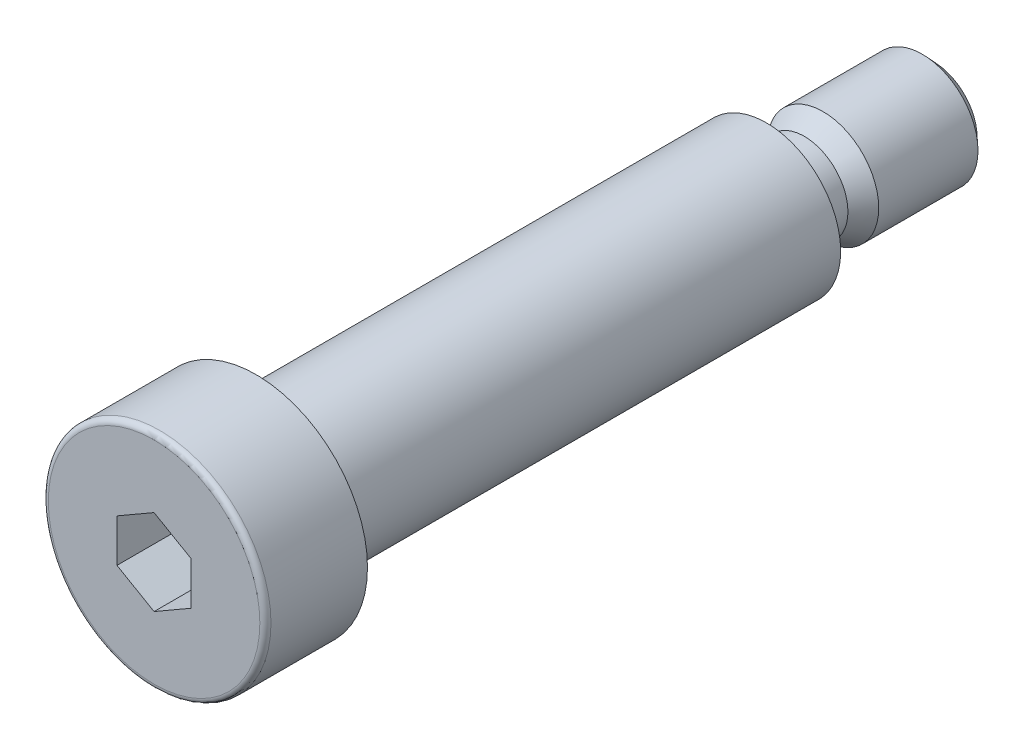
ISO-10303-21;
HEADER;
FILE_DESCRIPTION(('STEP AP214'),'2;1');
FILE_NAME('part.step','',(''),(''),'','','');
FILE_SCHEMA(('AUTOMOTIVE_DESIGN { 1 0 10303 214 1 1 1 1 }'));
ENDSEC;
DATA;
#1=APPLICATION_CONTEXT('core data for automotive mechanical design processes');
#2=APPLICATION_PROTOCOL_DEFINITION('international standard','automotive_design',2000,#1);
#3=PRODUCT_CONTEXT('',#1,'mechanical');
#4=PRODUCT('Part','Part','',(#3));
#5=PRODUCT_RELATED_PRODUCT_CATEGORY('part','',(#4));
#6=PRODUCT_DEFINITION_FORMATION('','',#4);
#7=PRODUCT_DEFINITION_CONTEXT('part definition',#1,'design');
#8=PRODUCT_DEFINITION('design','',#6,#7);
#9=PRODUCT_DEFINITION_SHAPE('','',#8);
#10=(LENGTH_UNIT() NAMED_UNIT(*) SI_UNIT(.MILLI.,.METRE.));
#11=(NAMED_UNIT(*) PLANE_ANGLE_UNIT() SI_UNIT($,.RADIAN.));
#12=(NAMED_UNIT(*) SI_UNIT($,.STERADIAN.) SOLID_ANGLE_UNIT());
#13=UNCERTAINTY_MEASURE_WITH_UNIT(LENGTH_MEASURE(1.E-05),#10,'distance_accuracy_value','');
#14=(GEOMETRIC_REPRESENTATION_CONTEXT(3) GLOBAL_UNCERTAINTY_ASSIGNED_CONTEXT((#13)) GLOBAL_UNIT_ASSIGNED_CONTEXT((#10,
#11,#12)) REPRESENTATION_CONTEXT('',''));
#15=CARTESIAN_POINT('',(0.,0.,0.));
#16=DIRECTION('',(0.,0.,1.));
#17=DIRECTION('',(1.,0.,0.));
#18=AXIS2_PLACEMENT_3D('',#15,#16,#17);
#19=CARTESIAN_POINT('',(0.,0.,38.5));
#20=DIRECTION('',(0.,0.,1.));
#21=DIRECTION('',(1.,0.,0.));
#22=AXIS2_PLACEMENT_3D('',#19,#20,#21);
#23=PLANE('',#22);
#24=CARTESIAN_POINT('',(0.,0.,38.5));
#25=DIRECTION('',(0.,0.,1.));
#26=DIRECTION('',(1.,0.,0.));
#27=AXIS2_PLACEMENT_3D('',#24,#25,#26);
#28=CIRCLE('',#27,11.4);
#29=CARTESIAN_POINT('',(11.4,0.,38.5));
#30=VERTEX_POINT('',#29);
#31=EDGE_CURVE('E42',#30,#30,#28,.T.);
#32=ORIENTED_EDGE('',*,*,#31,.T.);
#33=EDGE_LOOP('',(#32));
#34=FACE_BOUND('',#33,.T.);
#35=DIRECTION('',(0.,1.,0.));
#36=VECTOR('',#35,1.);
#37=CARTESIAN_POINT('',(4.,-2.30940107675851,38.5));
#38=LINE('',#37,#36);
#39=CARTESIAN_POINT('',(4.,-2.30940107675851,38.5));
#40=VERTEX_POINT('',#39);
#41=CARTESIAN_POINT('',(4.,2.3094010767585,38.5));
#42=VERTEX_POINT('',#41);
#43=EDGE_CURVE('E49',#40,#42,#38,.T.);
#44=ORIENTED_EDGE('',*,*,#43,.F.);
#45=DIRECTION('',(0.866025403784439,0.5,0.));
#46=VECTOR('',#45,1.);
#47=CARTESIAN_POINT('',(0.,-4.61880215351701,38.5));
#48=LINE('',#47,#46);
#49=CARTESIAN_POINT('',(0.,-4.61880215351701,38.5));
#50=VERTEX_POINT('',#49);
#51=EDGE_CURVE('E132',#50,#40,#48,.T.);
#52=ORIENTED_EDGE('',*,*,#51,.F.);
#53=DIRECTION('',(0.866025403784439,-0.5,0.));
#54=VECTOR('',#53,1.);
#55=CARTESIAN_POINT('',(-4.,-2.3094010767585,38.5));
#56=LINE('',#55,#54);
#57=CARTESIAN_POINT('',(-4.,-2.3094010767585,38.5));
#58=VERTEX_POINT('',#57);
#59=EDGE_CURVE('E130',#58,#50,#56,.T.);
#60=ORIENTED_EDGE('',*,*,#59,.F.);
#61=DIRECTION('',(0.,-1.,0.));
#62=VECTOR('',#61,1.);
#63=CARTESIAN_POINT('',(-4.,2.30940107675851,38.5));
#64=LINE('',#63,#62);
#65=CARTESIAN_POINT('',(-4.,2.30940107675851,38.5));
#66=VERTEX_POINT('',#65);
#67=EDGE_CURVE('E97',#66,#58,#64,.T.);
#68=ORIENTED_EDGE('',*,*,#67,.F.);
#69=DIRECTION('',(-0.866025403784439,-0.5,0.));
#70=VECTOR('',#69,1.);
#71=CARTESIAN_POINT('',(0.,4.61880215351701,38.5));
#72=LINE('',#71,#70);
#73=CARTESIAN_POINT('',(0.,4.61880215351701,38.5));
#74=VERTEX_POINT('',#73);
#75=EDGE_CURVE('E126',#74,#66,#72,.T.);
#76=ORIENTED_EDGE('',*,*,#75,.F.);
#77=DIRECTION('',(-0.866025403784439,0.5,0.));
#78=VECTOR('',#77,1.);
#79=CARTESIAN_POINT('',(4.,2.3094010767585,38.5));
#80=LINE('',#79,#78);
#81=EDGE_CURVE('E123',#42,#74,#80,.T.);
#82=ORIENTED_EDGE('',*,*,#81,.F.);
#83=EDGE_LOOP('',(#44,#52,#60,#68,#76,#82));
#84=FACE_BOUND('',#83,.T.);
#85=ADVANCED_FACE('F34',(#34,#84),#23,.T.);
#86=CARTESIAN_POINT('',(0.,0.,-45.5));
#87=DIRECTION('',(0.,0.,1.));
#88=DIRECTION('',(1.,0.,0.));
#89=AXIS2_PLACEMENT_3D('',#86,#87,#88);
#90=PLANE('',#89);
#91=CARTESIAN_POINT('',(0.,0.,-45.5));
#92=DIRECTION('',(0.,0.,1.));
#93=DIRECTION('',(1.,0.,0.));
#94=AXIS2_PLACEMENT_3D('',#91,#92,#93);
#95=CIRCLE('',#94,4.7);
#96=CARTESIAN_POINT('',(4.7,0.,-45.5));
#97=VERTEX_POINT('',#96);
#98=EDGE_CURVE('E162',#97,#97,#95,.T.);
#99=ORIENTED_EDGE('',*,*,#98,.F.);
#100=EDGE_LOOP('',(#99));
#101=FACE_BOUND('',#100,.T.);
#102=ADVANCED_FACE('F178',(#101),#90,.F.);
#103=CARTESIAN_POINT('',(0.,0.,-45.5));
#104=DIRECTION('',(0.,0.,1.));
#105=DIRECTION('',(1.,0.,0.));
#106=AXIS2_PLACEMENT_3D('',#103,#104,#105);
#107=CONICAL_SURFACE('',#106,4.7,0.825376850520742);
#108=CARTESIAN_POINT('',(0.,0.,-44.3));
#109=DIRECTION('',(0.,0.,1.));
#110=DIRECTION('',(1.,0.,0.));
#111=AXIS2_PLACEMENT_3D('',#108,#109,#110);
#112=CIRCLE('',#111,6.);
#113=CARTESIAN_POINT('',(6.,0.,-44.3));
#114=VERTEX_POINT('',#113);
#115=EDGE_CURVE('E159',#114,#114,#112,.T.);
#116=ORIENTED_EDGE('',*,*,#115,.F.);
#117=EDGE_LOOP('',(#116));
#118=FACE_BOUND('',#117,.T.);
#119=ORIENTED_EDGE('',*,*,#98,.T.);
#120=EDGE_LOOP('',(#119));
#121=FACE_BOUND('',#120,.T.);
#122=ADVANCED_FACE('F182',(#118,#121),#107,.T.);
#123=CARTESIAN_POINT('',(0.,0.,38.5));
#124=DIRECTION('',(0.,0.,1.));
#125=DIRECTION('',(1.,0.,0.));
#126=AXIS2_PLACEMENT_3D('',#123,#124,#125);
#127=CYLINDRICAL_SURFACE('',#126,6.);
#128=CARTESIAN_POINT('',(0.,0.,-33.6));
#129=DIRECTION('',(0.,0.,1.));
#130=DIRECTION('',(1.,0.,0.));
#131=AXIS2_PLACEMENT_3D('',#128,#129,#130);
#132=CIRCLE('',#131,6.);
#133=CARTESIAN_POINT('',(6.,0.,-33.6));
#134=VERTEX_POINT('',#133);
#135=EDGE_CURVE('E156',#134,#134,#132,.T.);
#136=ORIENTED_EDGE('',*,*,#135,.F.);
#137=EDGE_LOOP('',(#136));
#138=FACE_BOUND('',#137,.T.);
#139=ORIENTED_EDGE('',*,*,#115,.T.);
#140=EDGE_LOOP('',(#139));
#141=FACE_BOUND('',#140,.T.);
#142=ADVANCED_FACE('F188',(#138,#141),#127,.T.);
#143=CARTESIAN_POINT('',(0.,0.,-33.6));
#144=DIRECTION('',(0.,0.,-1.));
#145=DIRECTION('',(-1.,0.,0.));
#146=AXIS2_PLACEMENT_3D('',#143,#144,#145);
#147=CONICAL_SURFACE('',#146,6.,0.571837729916956);
#148=CARTESIAN_POINT('',(0.,0.,-31.58));
#149=DIRECTION('',(0.,0.,1.));
#150=DIRECTION('',(1.,0.,0.));
#151=AXIS2_PLACEMENT_3D('',#148,#149,#150);
#152=CIRCLE('',#151,4.70000000000001);
#153=CARTESIAN_POINT('',(4.70000000000001,0.,-31.58));
#154=VERTEX_POINT('',#153);
#155=EDGE_CURVE('E153',#154,#154,#152,.T.);
#156=ORIENTED_EDGE('',*,*,#155,.F.);
#157=EDGE_LOOP('',(#156));
#158=FACE_BOUND('',#157,.T.);
#159=ORIENTED_EDGE('',*,*,#135,.T.);
#160=EDGE_LOOP('',(#159));
#161=FACE_BOUND('',#160,.T.);
#162=ADVANCED_FACE('F192',(#158,#161),#147,.T.);
#163=CARTESIAN_POINT('',(0.,0.,38.5));
#164=DIRECTION('',(0.,0.,1.));
#165=DIRECTION('',(1.,0.,0.));
#166=AXIS2_PLACEMENT_3D('',#163,#164,#165);
#167=CYLINDRICAL_SURFACE('',#166,4.70000000000001);
#168=ORIENTED_EDGE('',*,*,#155,.T.);
#169=EDGE_LOOP('',(#168));
#170=FACE_BOUND('',#169,.T.);
#171=CARTESIAN_POINT('',(0.,0.,-27.5));
#172=DIRECTION('',(0.,0.,1.));
#173=DIRECTION('',(1.,0.,0.));
#174=AXIS2_PLACEMENT_3D('',#171,#172,#173);
#175=CIRCLE('',#174,4.70000000000001);
#176=CARTESIAN_POINT('',(4.70000000000001,0.,-27.5));
#177=VERTEX_POINT('',#176);
#178=EDGE_CURVE('E150',#177,#177,#175,.T.);
#179=ORIENTED_EDGE('',*,*,#178,.F.);
#180=EDGE_LOOP('',(#179));
#181=FACE_BOUND('',#180,.T.);
#182=ADVANCED_FACE('F196',(#170,#181),#167,.T.);
#183=CARTESIAN_POINT('',(0.,0.,-27.5));
#184=DIRECTION('',(0.,0.,1.));
#185=DIRECTION('',(1.,0.,0.));
#186=AXIS2_PLACEMENT_3D('',#183,#184,#185);
#187=PLANE('',#186);
#188=CARTESIAN_POINT('',(0.,0.,-27.5));
#189=DIRECTION('',(0.,0.,1.));
#190=DIRECTION('',(1.,0.,0.));
#191=AXIS2_PLACEMENT_3D('',#188,#189,#190);
#192=CIRCLE('',#191,7.99999999999999);
#193=CARTESIAN_POINT('',(7.99999999999999,0.,-27.5));
#194=VERTEX_POINT('',#193);
#195=EDGE_CURVE('E147',#194,#194,#192,.T.);
#196=ORIENTED_EDGE('',*,*,#195,.F.);
#197=EDGE_LOOP('',(#196));
#198=FACE_BOUND('',#197,.T.);
#199=ORIENTED_EDGE('',*,*,#178,.T.);
#200=EDGE_LOOP('',(#199));
#201=FACE_BOUND('',#200,.T.);
#202=ADVANCED_FACE('F200',(#198,#201),#187,.F.);
#203=CARTESIAN_POINT('',(0.,0.,38.5));
#204=DIRECTION('',(0.,0.,1.));
#205=DIRECTION('',(1.,0.,0.));
#206=AXIS2_PLACEMENT_3D('',#203,#204,#205);
#207=CYLINDRICAL_SURFACE('',#206,7.99999999999999);
#208=ORIENTED_EDGE('',*,*,#195,.T.);
#209=EDGE_LOOP('',(#208));
#210=FACE_BOUND('',#209,.T.);
#211=CARTESIAN_POINT('',(0.,0.,27.5));
#212=DIRECTION('',(0.,0.,1.));
#213=DIRECTION('',(1.,0.,0.));
#214=AXIS2_PLACEMENT_3D('',#211,#212,#213);
#215=CIRCLE('',#214,7.99999999999999);
#216=CARTESIAN_POINT('',(7.99999999999999,0.,27.5));
#217=VERTEX_POINT('',#216);
#218=EDGE_CURVE('E144',#217,#217,#215,.T.);
#219=ORIENTED_EDGE('',*,*,#218,.F.);
#220=EDGE_LOOP('',(#219));
#221=FACE_BOUND('',#220,.T.);
#222=ADVANCED_FACE('F204',(#210,#221),#207,.T.);
#223=CARTESIAN_POINT('',(0.,0.,27.5));
#224=DIRECTION('',(0.,0.,1.));
#225=DIRECTION('',(1.,0.,0.));
#226=AXIS2_PLACEMENT_3D('',#223,#224,#225);
#227=PLANE('',#226);
#228=CARTESIAN_POINT('',(0.,0.,27.5));
#229=DIRECTION('',(0.,0.,1.));
#230=DIRECTION('',(1.,0.,0.));
#231=AXIS2_PLACEMENT_3D('',#228,#229,#230);
#232=CIRCLE('',#231,12.);
#233=CARTESIAN_POINT('',(12.,0.,27.5));
#234=VERTEX_POINT('',#233);
#235=EDGE_CURVE('E136',#234,#234,#232,.T.);
#236=ORIENTED_EDGE('',*,*,#235,.F.);
#237=EDGE_LOOP('',(#236));
#238=FACE_BOUND('',#237,.T.);
#239=ORIENTED_EDGE('',*,*,#218,.T.);
#240=EDGE_LOOP('',(#239));
#241=FACE_BOUND('',#240,.T.);
#242=ADVANCED_FACE('F208',(#238,#241),#227,.F.);
#243=CARTESIAN_POINT('',(0.,0.,38.5));
#244=DIRECTION('',(0.,0.,1.));
#245=DIRECTION('',(1.,0.,0.));
#246=AXIS2_PLACEMENT_3D('',#243,#244,#245);
#247=CYLINDRICAL_SURFACE('',#246,12.);
#248=CARTESIAN_POINT('',(0.,0.,37.9));
#249=DIRECTION('',(0.,0.,1.));
#250=DIRECTION('',(1.,0.,0.));
#251=AXIS2_PLACEMENT_3D('',#248,#249,#250);
#252=CIRCLE('',#251,12.);
#253=CARTESIAN_POINT('',(12.,0.,37.9));
#254=VERTEX_POINT('',#253);
#255=EDGE_CURVE('E11',#254,#254,#252,.F.);
#256=ORIENTED_EDGE('',*,*,#255,.T.);
#257=EDGE_LOOP('',(#256));
#258=FACE_BOUND('',#257,.T.);
#259=ORIENTED_EDGE('',*,*,#235,.T.);
#260=EDGE_LOOP('',(#259));
#261=FACE_BOUND('',#260,.T.);
#262=ADVANCED_FACE('F212',(#258,#261),#247,.T.);
#263=CARTESIAN_POINT('',(4.,-2.30940107675851,31.9));
#264=DIRECTION('',(1.,0.,0.));
#265=DIRECTION('',(0.,0.,-1.));
#266=AXIS2_PLACEMENT_3D('',#263,#264,#265);
#267=PLANE('',#266);
#268=ORIENTED_EDGE('',*,*,#43,.T.);
#269=DIRECTION('',(0.,0.,1.));
#270=VECTOR('',#269,1.);
#271=CARTESIAN_POINT('',(4.,2.3094010767585,31.9));
#272=LINE('',#271,#270);
#273=CARTESIAN_POINT('',(4.,2.3094010767585,31.9));
#274=VERTEX_POINT('',#273);
#275=EDGE_CURVE('E79',#274,#42,#272,.T.);
#276=ORIENTED_EDGE('',*,*,#275,.F.);
#277=DIRECTION('',(0.,1.,0.));
#278=VECTOR('',#277,1.);
#279=CARTESIAN_POINT('',(4.,-2.30940107675851,31.9));
#280=LINE('',#279,#278);
#281=CARTESIAN_POINT('',(4.,-2.30940107675851,31.9));
#282=VERTEX_POINT('',#281);
#283=EDGE_CURVE('E134',#282,#274,#280,.T.);
#284=ORIENTED_EDGE('',*,*,#283,.F.);
#285=DIRECTION('',(0.,0.,1.));
#286=VECTOR('',#285,1.);
#287=CARTESIAN_POINT('',(4.,-2.30940107675851,31.9));
#288=LINE('',#287,#286);
#289=EDGE_CURVE('E57',#282,#40,#288,.T.);
#290=ORIENTED_EDGE('',*,*,#289,.T.);
#291=EDGE_LOOP('',(#268,#276,#284,#290));
#292=FACE_BOUND('',#291,.T.);
#293=ADVANCED_FACE('F216',(#292),#267,.F.);
#294=CARTESIAN_POINT('',(0.,-4.61880215351701,31.9));
#295=DIRECTION('',(0.5,-0.866025403784439,0.));
#296=DIRECTION('',(0.866025403784439,0.5,0.));
#297=AXIS2_PLACEMENT_3D('',#294,#295,#296);
#298=PLANE('',#297);
#299=ORIENTED_EDGE('',*,*,#51,.T.);
#300=ORIENTED_EDGE('',*,*,#289,.F.);
#301=DIRECTION('',(0.866025403784439,0.5,0.));
#302=VECTOR('',#301,1.);
#303=CARTESIAN_POINT('',(0.,-4.61880215351701,31.9));
#304=LINE('',#303,#302);
#305=CARTESIAN_POINT('',(0.,-4.61880215351701,31.9));
#306=VERTEX_POINT('',#305);
#307=EDGE_CURVE('E109',#306,#282,#304,.T.);
#308=ORIENTED_EDGE('',*,*,#307,.F.);
#309=DIRECTION('',(0.,0.,1.));
#310=VECTOR('',#309,1.);
#311=CARTESIAN_POINT('',(0.,-4.61880215351701,31.9));
#312=LINE('',#311,#310);
#313=EDGE_CURVE('E101',#306,#50,#312,.T.);
#314=ORIENTED_EDGE('',*,*,#313,.T.);
#315=EDGE_LOOP('',(#299,#300,#308,#314));
#316=FACE_BOUND('',#315,.T.);
#317=ADVANCED_FACE('F220',(#316),#298,.F.);
#318=CARTESIAN_POINT('',(-4.,-2.3094010767585,31.9));
#319=DIRECTION('',(-0.5,-0.866025403784439,0.));
#320=DIRECTION('',(0.866025403784439,-0.5,0.));
#321=AXIS2_PLACEMENT_3D('',#318,#319,#320);
#322=PLANE('',#321);
#323=ORIENTED_EDGE('',*,*,#59,.T.);
#324=ORIENTED_EDGE('',*,*,#313,.F.);
#325=DIRECTION('',(0.866025403784439,-0.5,0.));
#326=VECTOR('',#325,1.);
#327=CARTESIAN_POINT('',(-4.,-2.3094010767585,31.9));
#328=LINE('',#327,#326);
#329=CARTESIAN_POINT('',(-4.,-2.3094010767585,31.9));
#330=VERTEX_POINT('',#329);
#331=EDGE_CURVE('E105',#330,#306,#328,.T.);
#332=ORIENTED_EDGE('',*,*,#331,.F.);
#333=DIRECTION('',(0.,0.,1.));
#334=VECTOR('',#333,1.);
#335=CARTESIAN_POINT('',(-4.,-2.3094010767585,31.9));
#336=LINE('',#335,#334);
#337=EDGE_CURVE('E90',#330,#58,#336,.T.);
#338=ORIENTED_EDGE('',*,*,#337,.T.);
#339=EDGE_LOOP('',(#323,#324,#332,#338));
#340=FACE_BOUND('',#339,.T.);
#341=ADVANCED_FACE('F106',(#340),#322,.F.);
#342=CARTESIAN_POINT('',(-4.,2.30940107675851,31.9));
#343=DIRECTION('',(-1.,0.,0.));
#344=DIRECTION('',(0.,-1.,0.));
#345=AXIS2_PLACEMENT_3D('',#342,#343,#344);
#346=PLANE('',#345);
#347=ORIENTED_EDGE('',*,*,#67,.T.);
#348=ORIENTED_EDGE('',*,*,#337,.F.);
#349=DIRECTION('',(0.,-1.,0.));
#350=VECTOR('',#349,1.);
#351=CARTESIAN_POINT('',(-4.,2.30940107675851,31.9));
#352=LINE('',#351,#350);
#353=CARTESIAN_POINT('',(-4.,2.30940107675851,31.9));
#354=VERTEX_POINT('',#353);
#355=EDGE_CURVE('E94',#354,#330,#352,.T.);
#356=ORIENTED_EDGE('',*,*,#355,.F.);
#357=DIRECTION('',(0.,0.,1.));
#358=VECTOR('',#357,1.);
#359=CARTESIAN_POINT('',(-4.,2.30940107675851,31.9));
#360=LINE('',#359,#358);
#361=EDGE_CURVE('E102',#354,#66,#360,.T.);
#362=ORIENTED_EDGE('',*,*,#361,.T.);
#363=EDGE_LOOP('',(#347,#348,#356,#362));
#364=FACE_BOUND('',#363,.T.);
#365=ADVANCED_FACE('F92',(#364),#346,.F.);
#366=CARTESIAN_POINT('',(0.,4.61880215351701,31.9));
#367=DIRECTION('',(-0.5,0.866025403784439,0.));
#368=DIRECTION('',(-0.866025403784439,-0.5,0.));
#369=AXIS2_PLACEMENT_3D('',#366,#367,#368);
#370=PLANE('',#369);
#371=ORIENTED_EDGE('',*,*,#75,.T.);
#372=ORIENTED_EDGE('',*,*,#361,.F.);
#373=DIRECTION('',(-0.866025403784439,-0.5,0.));
#374=VECTOR('',#373,1.);
#375=CARTESIAN_POINT('',(0.,4.61880215351701,31.9));
#376=LINE('',#375,#374);
#377=CARTESIAN_POINT('',(0.,4.61880215351701,31.9));
#378=VERTEX_POINT('',#377);
#379=EDGE_CURVE('E115',#378,#354,#376,.T.);
#380=ORIENTED_EDGE('',*,*,#379,.F.);
#381=DIRECTION('',(0.,0.,1.));
#382=VECTOR('',#381,1.);
#383=CARTESIAN_POINT('',(0.,4.61880215351701,31.9));
#384=LINE('',#383,#382);
#385=EDGE_CURVE('E139',#378,#74,#384,.T.);
#386=ORIENTED_EDGE('',*,*,#385,.T.);
#387=EDGE_LOOP('',(#371,#372,#380,#386));
#388=FACE_BOUND('',#387,.T.);
#389=ADVANCED_FACE('F223',(#388),#370,.F.);
#390=CARTESIAN_POINT('',(4.,2.3094010767585,31.9));
#391=DIRECTION('',(0.5,0.866025403784439,0.));
#392=DIRECTION('',(-0.866025403784439,0.5,0.));
#393=AXIS2_PLACEMENT_3D('',#390,#391,#392);
#394=PLANE('',#393);
#395=ORIENTED_EDGE('',*,*,#81,.T.);
#396=ORIENTED_EDGE('',*,*,#385,.F.);
#397=DIRECTION('',(-0.866025403784439,0.5,0.));
#398=VECTOR('',#397,1.);
#399=CARTESIAN_POINT('',(4.,2.3094010767585,31.9));
#400=LINE('',#399,#398);
#401=EDGE_CURVE('E117',#274,#378,#400,.T.);
#402=ORIENTED_EDGE('',*,*,#401,.F.);
#403=ORIENTED_EDGE('',*,*,#275,.T.);
#404=EDGE_LOOP('',(#395,#396,#402,#403));
#405=FACE_BOUND('',#404,.T.);
#406=ADVANCED_FACE('F174',(#405),#394,.F.);
#407=CARTESIAN_POINT('',(0.,0.,31.9));
#408=DIRECTION('',(0.,0.,1.));
#409=DIRECTION('',(1.,0.,0.));
#410=AXIS2_PLACEMENT_3D('',#407,#408,#409);
#411=PLANE('',#410);
#412=ORIENTED_EDGE('',*,*,#283,.T.);
#413=ORIENTED_EDGE('',*,*,#401,.T.);
#414=ORIENTED_EDGE('',*,*,#379,.T.);
#415=ORIENTED_EDGE('',*,*,#355,.T.);
#416=ORIENTED_EDGE('',*,*,#331,.T.);
#417=ORIENTED_EDGE('',*,*,#307,.T.);
#418=EDGE_LOOP('',(#412,#413,#414,#415,#416,#417));
#419=FACE_BOUND('',#418,.T.);
#420=ADVANCED_FACE('F112',(#419),#411,.T.);
#421=CARTESIAN_POINT('',(0.,0.,37.9));
#422=DIRECTION('',(0.,0.,1.));
#423=DIRECTION('',(1.,0.,0.));
#424=AXIS2_PLACEMENT_3D('',#421,#422,#423);
#425=TOROIDAL_SURFACE('',#424,11.4,0.6);
#426=ORIENTED_EDGE('',*,*,#255,.F.);
#427=EDGE_LOOP('',(#426));
#428=FACE_BOUND('',#427,.T.);
#429=ORIENTED_EDGE('',*,*,#31,.F.);
#430=EDGE_LOOP('',(#429));
#431=FACE_BOUND('',#430,.T.);
#432=ADVANCED_FACE('F36',(#428,#431),#425,.T.);
#433=CLOSED_SHELL('',(#85,#102,#122,#142,#162,#182,#202,#222,#242,#262,#293,#317,#341,#365,#389,
#406,#420,#432));
#434=MANIFOLD_SOLID_BREP('B2',#433);
#435=ADVANCED_BREP_SHAPE_REPRESENTATION('',(#18,#434),#14);
#436=SHAPE_DEFINITION_REPRESENTATION(#9,#435);
ENDSEC;
END-ISO-10303-21;
